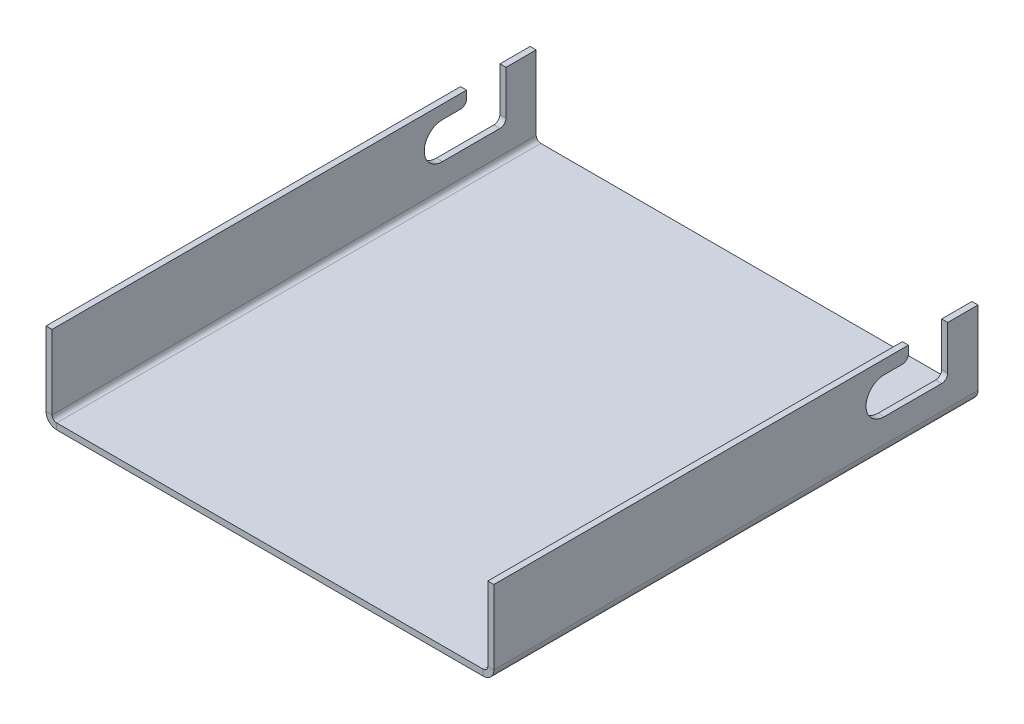
ISO-10303-21;
HEADER;
FILE_DESCRIPTION(('STEP AP214'),'2;1');
FILE_NAME('part.step','',(''),(''),'','','');
FILE_SCHEMA(('AUTOMOTIVE_DESIGN { 1 0 10303 214 1 1 1 1 }'));
ENDSEC;
DATA;
#1=APPLICATION_CONTEXT('core data for automotive mechanical design processes');
#2=APPLICATION_PROTOCOL_DEFINITION('international standard','automotive_design',2000,#1);
#3=PRODUCT_CONTEXT('',#1,'mechanical');
#4=PRODUCT('Part','Part','',(#3));
#5=PRODUCT_RELATED_PRODUCT_CATEGORY('part','',(#4));
#6=PRODUCT_DEFINITION_FORMATION('','',#4);
#7=PRODUCT_DEFINITION_CONTEXT('part definition',#1,'design');
#8=PRODUCT_DEFINITION('design','',#6,#7);
#9=PRODUCT_DEFINITION_SHAPE('','',#8);
#10=(LENGTH_UNIT() NAMED_UNIT(*) SI_UNIT(.MILLI.,.METRE.));
#11=(NAMED_UNIT(*) PLANE_ANGLE_UNIT() SI_UNIT($,.RADIAN.));
#12=(NAMED_UNIT(*) SI_UNIT($,.STERADIAN.) SOLID_ANGLE_UNIT());
#13=UNCERTAINTY_MEASURE_WITH_UNIT(LENGTH_MEASURE(1.E-05),#10,'distance_accuracy_value','');
#14=(GEOMETRIC_REPRESENTATION_CONTEXT(3) GLOBAL_UNCERTAINTY_ASSIGNED_CONTEXT((#13)) GLOBAL_UNIT_ASSIGNED_CONTEXT((#10,
#11,#12)) REPRESENTATION_CONTEXT('',''));
#15=CARTESIAN_POINT('',(0.,0.,0.));
#16=DIRECTION('',(0.,0.,1.));
#17=DIRECTION('',(1.,0.,0.));
#18=AXIS2_PLACEMENT_3D('',#15,#16,#17);
#19=CARTESIAN_POINT('',(0.,-1.,0.));
#20=DIRECTION('',(0.,1.,0.));
#21=DIRECTION('',(0.,0.,1.));
#22=AXIS2_PLACEMENT_3D('',#19,#20,#21);
#23=PLANE('',#22);
#24=DIRECTION('',(0.,0.,1.));
#25=VECTOR('',#24,1.);
#26=CARTESIAN_POINT('',(-35.238,-0.999999999999997,40.));
#27=LINE('',#26,#25);
#28=CARTESIAN_POINT('',(-35.238,-0.999999999999997,40.));
#29=VERTEX_POINT('',#28);
#30=CARTESIAN_POINT('',(-35.238,-1.,-40.));
#31=VERTEX_POINT('',#30);
#32=EDGE_CURVE('E501',#29,#31,#27,.F.);
#33=ORIENTED_EDGE('',*,*,#32,.T.);
#34=DIRECTION('',(-1.,0.,0.));
#35=VECTOR('',#34,1.);
#36=CARTESIAN_POINT('',(36.,-1.,-40.));
#37=LINE('',#36,#35);
#38=CARTESIAN_POINT('',(35.238,-0.999999999999997,-40.));
#39=VERTEX_POINT('',#38);
#40=EDGE_CURVE('E584',#39,#31,#37,.T.);
#41=ORIENTED_EDGE('',*,*,#40,.F.);
#42=DIRECTION('',(0.,0.,-1.));
#43=VECTOR('',#42,1.);
#44=CARTESIAN_POINT('',(35.238,-0.999999999999997,-40.));
#45=LINE('',#44,#43);
#46=CARTESIAN_POINT('',(35.238,-1.,40.));
#47=VERTEX_POINT('',#46);
#48=EDGE_CURVE('E558',#39,#47,#45,.F.);
#49=ORIENTED_EDGE('',*,*,#48,.T.);
#50=DIRECTION('',(1.,0.,0.));
#51=VECTOR('',#50,1.);
#52=CARTESIAN_POINT('',(36.,-1.,40.));
#53=LINE('',#52,#51);
#54=EDGE_CURVE('E582',#29,#47,#53,.T.);
#55=ORIENTED_EDGE('',*,*,#54,.F.);
#56=EDGE_LOOP('',(#33,#41,#49,#55));
#57=FACE_BOUND('',#56,.T.);
#58=DIRECTION('',(-1.,0.,0.));
#59=VECTOR('',#58,1.);
#60=CARTESIAN_POINT('',(25.238,-1.,-25.));
#61=LINE('',#60,#59);
#62=CARTESIAN_POINT('',(25.238,-1.,-25.));
#63=VERTEX_POINT('',#62);
#64=CARTESIAN_POINT('',(-25.238,-1.,-25.));
#65=VERTEX_POINT('',#64);
#66=EDGE_CURVE('E212',#63,#65,#61,.T.);
#67=ORIENTED_EDGE('',*,*,#66,.T.);
#68=DIRECTION('',(0.,0.,1.));
#69=VECTOR('',#68,1.);
#70=CARTESIAN_POINT('',(-25.238,-1.,25.));
#71=LINE('',#70,#69);
#72=CARTESIAN_POINT('',(-25.238,-1.,25.));
#73=VERTEX_POINT('',#72);
#74=EDGE_CURVE('E13',#65,#73,#71,.T.);
#75=ORIENTED_EDGE('',*,*,#74,.T.);
#76=DIRECTION('',(1.,0.,0.));
#77=VECTOR('',#76,1.);
#78=CARTESIAN_POINT('',(25.238,-1.,25.));
#79=LINE('',#78,#77);
#80=CARTESIAN_POINT('',(25.238,-1.,25.));
#81=VERTEX_POINT('',#80);
#82=EDGE_CURVE('E638',#73,#81,#79,.T.);
#83=ORIENTED_EDGE('',*,*,#82,.T.);
#84=DIRECTION('',(0.,0.,-1.));
#85=VECTOR('',#84,1.);
#86=CARTESIAN_POINT('',(25.238,-1.,25.));
#87=LINE('',#86,#85);
#88=EDGE_CURVE('E642',#81,#63,#87,.T.);
#89=ORIENTED_EDGE('',*,*,#88,.T.);
#90=EDGE_LOOP('',(#67,#75,#83,#89));
#91=FACE_BOUND('',#90,.T.);
#92=ADVANCED_FACE('F203',(#57,#91),#23,.F.);
#93=CARTESIAN_POINT('',(37.,13.,40.));
#94=DIRECTION('',(0.,-1.,0.));
#95=DIRECTION('',(1.,0.,0.));
#96=AXIS2_PLACEMENT_3D('',#93,#94,#95);
#97=PLANE('',#96);
#98=DIRECTION('',(0.,0.,1.));
#99=VECTOR('',#98,1.);
#100=CARTESIAN_POINT('',(37.,13.,40.));
#101=LINE('',#100,#99);
#102=CARTESIAN_POINT('',(37.,13.0000000000003,-28.5));
#103=VERTEX_POINT('',#102);
#104=CARTESIAN_POINT('',(37.,13.,40.));
#105=VERTEX_POINT('',#104);
#106=EDGE_CURVE('E536',#103,#105,#101,.T.);
#107=ORIENTED_EDGE('',*,*,#106,.F.);
#108=DIRECTION('',(-1.,0.,0.));
#109=VECTOR('',#108,1.);
#110=CARTESIAN_POINT('',(37.,13.0000000000003,-28.5));
#111=LINE('',#110,#109);
#112=CARTESIAN_POINT('',(36.,13.0000000000003,-28.5));
#113=VERTEX_POINT('',#112);
#114=EDGE_CURVE('E445',#103,#113,#111,.T.);
#115=ORIENTED_EDGE('',*,*,#114,.T.);
#116=DIRECTION('',(0.,0.,1.));
#117=VECTOR('',#116,1.);
#118=CARTESIAN_POINT('',(36.,13.,40.));
#119=LINE('',#118,#117);
#120=CARTESIAN_POINT('',(36.,13.,40.));
#121=VERTEX_POINT('',#120);
#122=EDGE_CURVE('E546',#113,#121,#119,.T.);
#123=ORIENTED_EDGE('',*,*,#122,.T.);
#124=DIRECTION('',(-1.,0.,0.));
#125=VECTOR('',#124,1.);
#126=CARTESIAN_POINT('',(37.,13.,40.));
#127=LINE('',#126,#125);
#128=EDGE_CURVE('E544',#105,#121,#127,.T.);
#129=ORIENTED_EDGE('',*,*,#128,.F.);
#130=EDGE_LOOP('',(#107,#115,#123,#129));
#131=FACE_BOUND('',#130,.T.);
#132=ADVANCED_FACE('F660',(#131),#97,.F.);
#133=CARTESIAN_POINT('',(-37.,13.,-40.));
#134=DIRECTION('',(0.,-1.,0.));
#135=DIRECTION('',(1.,0.,0.));
#136=AXIS2_PLACEMENT_3D('',#133,#134,#135);
#137=PLANE('',#136);
#138=DIRECTION('',(0.,0.,-1.));
#139=VECTOR('',#138,1.);
#140=CARTESIAN_POINT('',(-36.,13.,-40.));
#141=LINE('',#140,#139);
#142=CARTESIAN_POINT('',(-36.,13.,40.));
#143=VERTEX_POINT('',#142);
#144=CARTESIAN_POINT('',(-36.,13.,-28.5));
#145=VERTEX_POINT('',#144);
#146=EDGE_CURVE('E481',#143,#145,#141,.T.);
#147=ORIENTED_EDGE('',*,*,#146,.T.);
#148=DIRECTION('',(-1.,0.,0.));
#149=VECTOR('',#148,1.);
#150=CARTESIAN_POINT('',(-37.,13.,-28.5));
#151=LINE('',#150,#149);
#152=CARTESIAN_POINT('',(-37.,13.,-28.5));
#153=VERTEX_POINT('',#152);
#154=EDGE_CURVE('E594',#145,#153,#151,.T.);
#155=ORIENTED_EDGE('',*,*,#154,.T.);
#156=DIRECTION('',(0.,0.,-1.));
#157=VECTOR('',#156,1.);
#158=CARTESIAN_POINT('',(-37.,13.,-40.));
#159=LINE('',#158,#157);
#160=CARTESIAN_POINT('',(-37.,13.,40.));
#161=VERTEX_POINT('',#160);
#162=EDGE_CURVE('E484',#161,#153,#159,.T.);
#163=ORIENTED_EDGE('',*,*,#162,.F.);
#164=DIRECTION('',(1.,0.,0.));
#165=VECTOR('',#164,1.);
#166=CARTESIAN_POINT('',(-37.,13.,40.));
#167=LINE('',#166,#165);
#168=EDGE_CURVE('E497',#161,#143,#167,.T.);
#169=ORIENTED_EDGE('',*,*,#168,.T.);
#170=EDGE_LOOP('',(#147,#155,#163,#169));
#171=FACE_BOUND('',#170,.T.);
#172=ADVANCED_FACE('F651',(#171),#137,.F.);
#173=ORIENTED_EDGE('',*,*,#74,.F.);
#174=ORIENTED_EDGE('',*,*,#66,.F.);
#175=ORIENTED_EDGE('',*,*,#88,.F.);
#176=ORIENTED_EDGE('',*,*,#82,.F.);
#177=EDGE_LOOP('',(#173,#174,#175,#176));
#178=FACE_BOUND('',#177,.T.);
#179=ADVANCED_FACE('F648',(#178),#23,.F.);
#180=CARTESIAN_POINT('',(0.,0.,0.));
#181=DIRECTION('',(0.,1.,0.));
#182=DIRECTION('',(0.,0.,1.));
#183=AXIS2_PLACEMENT_3D('',#180,#181,#182);
#184=PLANE('',#183);
#185=DIRECTION('',(-1.,0.,0.));
#186=VECTOR('',#185,1.);
#187=CARTESIAN_POINT('',(36.,0.,-40.));
#188=LINE('',#187,#186);
#189=CARTESIAN_POINT('',(35.238,0.,-40.));
#190=VERTEX_POINT('',#189);
#191=CARTESIAN_POINT('',(-35.238,0.,-40.));
#192=VERTEX_POINT('',#191);
#193=EDGE_CURVE('E585',#190,#192,#188,.T.);
#194=ORIENTED_EDGE('',*,*,#193,.T.);
#195=DIRECTION('',(0.,0.,1.));
#196=VECTOR('',#195,1.);
#197=CARTESIAN_POINT('',(-35.238,0.,40.));
#198=LINE('',#197,#196);
#199=CARTESIAN_POINT('',(-35.238,0.,40.));
#200=VERTEX_POINT('',#199);
#201=EDGE_CURVE('E513',#200,#192,#198,.F.);
#202=ORIENTED_EDGE('',*,*,#201,.F.);
#203=DIRECTION('',(1.,0.,0.));
#204=VECTOR('',#203,1.);
#205=CARTESIAN_POINT('',(36.,0.,40.));
#206=LINE('',#205,#204);
#207=CARTESIAN_POINT('',(35.238,0.,40.));
#208=VERTEX_POINT('',#207);
#209=EDGE_CURVE('E579',#200,#208,#206,.T.);
#210=ORIENTED_EDGE('',*,*,#209,.T.);
#211=DIRECTION('',(0.,0.,-1.));
#212=VECTOR('',#211,1.);
#213=CARTESIAN_POINT('',(35.238,0.,-40.));
#214=LINE('',#213,#212);
#215=EDGE_CURVE('E571',#190,#208,#214,.F.);
#216=ORIENTED_EDGE('',*,*,#215,.F.);
#217=EDGE_LOOP('',(#194,#202,#210,#216));
#218=FACE_BOUND('',#217,.T.);
#219=ADVANCED_FACE('F650',(#218),#184,.T.);
#220=CARTESIAN_POINT('',(36.,-1.,40.));
#221=DIRECTION('',(0.,0.,1.));
#222=DIRECTION('',(1.,0.,0.));
#223=AXIS2_PLACEMENT_3D('',#220,#221,#222);
#224=PLANE('',#223);
#225=ORIENTED_EDGE('',*,*,#209,.F.);
#226=DIRECTION('',(0.,-1.,0.));
#227=VECTOR('',#226,1.);
#228=CARTESIAN_POINT('',(-35.238,0.,40.));
#229=LINE('',#228,#227);
#230=EDGE_CURVE('E507',#200,#29,#229,.T.);
#231=ORIENTED_EDGE('',*,*,#230,.T.);
#232=ORIENTED_EDGE('',*,*,#54,.T.);
#233=DIRECTION('',(0.,-1.,0.));
#234=VECTOR('',#233,1.);
#235=CARTESIAN_POINT('',(35.238,0.,40.));
#236=LINE('',#235,#234);
#237=EDGE_CURVE('E576',#208,#47,#236,.T.);
#238=ORIENTED_EDGE('',*,*,#237,.F.);
#239=EDGE_LOOP('',(#225,#231,#232,#238));
#240=FACE_BOUND('',#239,.T.);
#241=ADVANCED_FACE('F657',(#240),#224,.T.);
#242=CARTESIAN_POINT('',(36.,-1.,-40.));
#243=DIRECTION('',(0.,0.,-1.));
#244=DIRECTION('',(-1.,0.,0.));
#245=AXIS2_PLACEMENT_3D('',#242,#243,#244);
#246=PLANE('',#245);
#247=DIRECTION('',(0.,-1.,0.));
#248=VECTOR('',#247,1.);
#249=CARTESIAN_POINT('',(-35.238,0.,-40.));
#250=LINE('',#249,#248);
#251=EDGE_CURVE('E518',#192,#31,#250,.T.);
#252=ORIENTED_EDGE('',*,*,#251,.F.);
#253=ORIENTED_EDGE('',*,*,#193,.F.);
#254=DIRECTION('',(0.,-1.,0.));
#255=VECTOR('',#254,1.);
#256=CARTESIAN_POINT('',(35.238,0.,-40.));
#257=LINE('',#256,#255);
#258=EDGE_CURVE('E565',#190,#39,#257,.T.);
#259=ORIENTED_EDGE('',*,*,#258,.T.);
#260=ORIENTED_EDGE('',*,*,#40,.T.);
#261=EDGE_LOOP('',(#252,#253,#259,#260));
#262=FACE_BOUND('',#261,.T.);
#263=ADVANCED_FACE('F677',(#262),#246,.T.);
#264=CARTESIAN_POINT('',(35.238,0.762000000000002,40.));
#265=DIRECTION('',(0.,0.,1.));
#266=DIRECTION('',(1.,0.,0.));
#267=AXIS2_PLACEMENT_3D('',#264,#265,#266);
#268=PLANE('',#267);
#269=DIRECTION('',(1.,0.,0.));
#270=VECTOR('',#269,1.);
#271=CARTESIAN_POINT('',(36.,0.761999999999999,40.));
#272=LINE('',#271,#270);
#273=CARTESIAN_POINT('',(36.,0.761999999999999,40.));
#274=VERTEX_POINT('',#273);
#275=CARTESIAN_POINT('',(37.,0.761999999999995,40.));
#276=VERTEX_POINT('',#275);
#277=EDGE_CURVE('E521',#274,#276,#272,.T.);
#278=ORIENTED_EDGE('',*,*,#277,.F.);
#279=CARTESIAN_POINT('',(35.238,0.762000000000002,40.));
#280=DIRECTION('',(0.,0.,-1.));
#281=DIRECTION('',(-1.,0.,0.));
#282=AXIS2_PLACEMENT_3D('',#279,#280,#281);
#283=CIRCLE('',#282,0.761999999999999);
#284=EDGE_CURVE('E568',#208,#274,#283,.F.);
#285=ORIENTED_EDGE('',*,*,#284,.F.);
#286=ORIENTED_EDGE('',*,*,#237,.T.);
#287=CARTESIAN_POINT('',(35.238,0.762000000000002,40.));
#288=DIRECTION('',(0.,0.,-1.));
#289=DIRECTION('',(-1.,0.,0.));
#290=AXIS2_PLACEMENT_3D('',#287,#288,#289);
#291=CIRCLE('',#290,1.762);
#292=EDGE_CURVE('E561',#47,#276,#291,.F.);
#293=ORIENTED_EDGE('',*,*,#292,.T.);
#294=EDGE_LOOP('',(#278,#285,#286,#293));
#295=FACE_BOUND('',#294,.T.);
#296=ADVANCED_FACE('F783',(#295),#268,.T.);
#297=CARTESIAN_POINT('',(35.238,0.762000000000002,-40.));
#298=DIRECTION('',(0.,0.,1.));
#299=DIRECTION('',(1.,0.,0.));
#300=AXIS2_PLACEMENT_3D('',#297,#298,#299);
#301=PLANE('',#300);
#302=CARTESIAN_POINT('',(35.238,0.762000000000002,-40.));
#303=DIRECTION('',(0.,0.,-1.));
#304=DIRECTION('',(-1.,0.,0.));
#305=AXIS2_PLACEMENT_3D('',#302,#303,#304);
#306=CIRCLE('',#305,0.761999999999999);
#307=CARTESIAN_POINT('',(36.,0.761999999999999,-40.));
#308=VERTEX_POINT('',#307);
#309=EDGE_CURVE('E557',#308,#190,#306,.T.);
#310=ORIENTED_EDGE('',*,*,#309,.F.);
#311=DIRECTION('',(1.,0.,0.));
#312=VECTOR('',#311,1.);
#313=CARTESIAN_POINT('',(36.,0.761999999999999,-40.));
#314=LINE('',#313,#312);
#315=CARTESIAN_POINT('',(37.,0.761999999999995,-40.));
#316=VERTEX_POINT('',#315);
#317=EDGE_CURVE('E526',#308,#316,#314,.T.);
#318=ORIENTED_EDGE('',*,*,#317,.T.);
#319=CARTESIAN_POINT('',(35.238,0.762000000000002,-40.));
#320=DIRECTION('',(0.,0.,-1.));
#321=DIRECTION('',(-1.,0.,0.));
#322=AXIS2_PLACEMENT_3D('',#319,#320,#321);
#323=CIRCLE('',#322,1.762);
#324=EDGE_CURVE('E562',#316,#39,#323,.T.);
#325=ORIENTED_EDGE('',*,*,#324,.T.);
#326=ORIENTED_EDGE('',*,*,#258,.F.);
#327=EDGE_LOOP('',(#310,#318,#325,#326));
#328=FACE_BOUND('',#327,.T.);
#329=ADVANCED_FACE('F778',(#328),#301,.F.);
#330=CARTESIAN_POINT('',(35.238,0.762000000000002,-40.));
#331=DIRECTION('',(0.,0.,-1.));
#332=DIRECTION('',(1.,0.,0.));
#333=AXIS2_PLACEMENT_3D('',#330,#331,#332);
#334=CYLINDRICAL_SURFACE('',#333,1.762);
#335=ORIENTED_EDGE('',*,*,#48,.F.);
#336=ORIENTED_EDGE('',*,*,#324,.F.);
#337=DIRECTION('',(0.,0.,1.));
#338=VECTOR('',#337,1.);
#339=CARTESIAN_POINT('',(37.,0.761999999999995,0.));
#340=LINE('',#339,#338);
#341=EDGE_CURVE('E529',#316,#276,#340,.T.);
#342=ORIENTED_EDGE('',*,*,#341,.T.);
#343=ORIENTED_EDGE('',*,*,#292,.F.);
#344=EDGE_LOOP('',(#335,#336,#342,#343));
#345=FACE_BOUND('',#344,.T.);
#346=ADVANCED_FACE('F775',(#345),#334,.T.);
#347=CARTESIAN_POINT('',(35.238,0.762000000000002,-40.));
#348=DIRECTION('',(0.,0.,-1.));
#349=DIRECTION('',(1.,0.,0.));
#350=AXIS2_PLACEMENT_3D('',#347,#348,#349);
#351=CYLINDRICAL_SURFACE('',#350,0.761999999999999);
#352=ORIENTED_EDGE('',*,*,#215,.T.);
#353=ORIENTED_EDGE('',*,*,#284,.T.);
#354=DIRECTION('',(0.,0.,-1.));
#355=VECTOR('',#354,1.);
#356=CARTESIAN_POINT('',(36.,0.761999999999999,40.));
#357=LINE('',#356,#355);
#358=EDGE_CURVE('E524',#274,#308,#357,.T.);
#359=ORIENTED_EDGE('',*,*,#358,.T.);
#360=ORIENTED_EDGE('',*,*,#309,.T.);
#361=EDGE_LOOP('',(#352,#353,#359,#360));
#362=FACE_BOUND('',#361,.T.);
#363=ADVANCED_FACE('F773',(#362),#351,.F.);
#364=CARTESIAN_POINT('',(37.,13.,-40.));
#365=DIRECTION('',(0.,0.,1.));
#366=DIRECTION('',(1.,0.,0.));
#367=AXIS2_PLACEMENT_3D('',#364,#365,#366);
#368=PLANE('',#367);
#369=ORIENTED_EDGE('',*,*,#317,.F.);
#370=DIRECTION('',(0.,1.,0.));
#371=VECTOR('',#370,1.);
#372=CARTESIAN_POINT('',(36.,13.,-40.));
#373=LINE('',#372,#371);
#374=CARTESIAN_POINT('',(36.,13.,-40.));
#375=VERTEX_POINT('',#374);
#376=EDGE_CURVE('E533',#308,#375,#373,.T.);
#377=ORIENTED_EDGE('',*,*,#376,.T.);
#378=DIRECTION('',(-1.,0.,0.));
#379=VECTOR('',#378,1.);
#380=CARTESIAN_POINT('',(37.,13.,-40.));
#381=LINE('',#380,#379);
#382=CARTESIAN_POINT('',(37.,13.,-40.));
#383=VERTEX_POINT('',#382);
#384=EDGE_CURVE('E554',#383,#375,#381,.T.);
#385=ORIENTED_EDGE('',*,*,#384,.F.);
#386=DIRECTION('',(0.,1.,0.));
#387=VECTOR('',#386,1.);
#388=CARTESIAN_POINT('',(37.,13.,-40.));
#389=LINE('',#388,#387);
#390=EDGE_CURVE('E534',#316,#383,#389,.T.);
#391=ORIENTED_EDGE('',*,*,#390,.F.);
#392=EDGE_LOOP('',(#369,#377,#385,#391));
#393=FACE_BOUND('',#392,.T.);
#394=ADVANCED_FACE('F766',(#393),#368,.F.);
#395=CARTESIAN_POINT('',(37.,0.,40.));
#396=DIRECTION('',(0.,0.,-1.));
#397=DIRECTION('',(-1.,0.,0.));
#398=AXIS2_PLACEMENT_3D('',#395,#396,#397);
#399=PLANE('',#398);
#400=ORIENTED_EDGE('',*,*,#277,.T.);
#401=DIRECTION('',(0.,-1.,0.));
#402=VECTOR('',#401,1.);
#403=CARTESIAN_POINT('',(37.,0.,40.));
#404=LINE('',#403,#402);
#405=EDGE_CURVE('E541',#105,#276,#404,.T.);
#406=ORIENTED_EDGE('',*,*,#405,.F.);
#407=ORIENTED_EDGE('',*,*,#128,.T.);
#408=DIRECTION('',(0.,-1.,0.));
#409=VECTOR('',#408,1.);
#410=CARTESIAN_POINT('',(36.,0.,40.));
#411=LINE('',#410,#409);
#412=EDGE_CURVE('E537',#121,#274,#411,.T.);
#413=ORIENTED_EDGE('',*,*,#412,.T.);
#414=EDGE_LOOP('',(#400,#406,#407,#413));
#415=FACE_BOUND('',#414,.T.);
#416=ADVANCED_FACE('F761',(#415),#399,.F.);
#417=CARTESIAN_POINT('',(37.,-1.37999270860737E-13,0.));
#418=DIRECTION('',(-1.,0.,0.));
#419=DIRECTION('',(0.,-1.,0.));
#420=AXIS2_PLACEMENT_3D('',#417,#418,#419);
#421=PLANE('',#420);
#422=DIRECTION('',(0.,0.,-1.));
#423=VECTOR('',#422,1.);
#424=CARTESIAN_POINT('',(37.0000000000001,10.7620000000002,-24.5));
#425=LINE('',#424,#423);
#426=CARTESIAN_POINT('',(37.0000000000001,10.7620000000002,-24.5));
#427=VERTEX_POINT('',#426);
#428=CARTESIAN_POINT('',(37.0000000000001,10.7620000000002,-27.5));
#429=VERTEX_POINT('',#428);
#430=EDGE_CURVE('E424',#427,#429,#425,.T.);
#431=ORIENTED_EDGE('',*,*,#430,.T.);
#432=CARTESIAN_POINT('',(37.,11.7620000000002,-27.5));
#433=DIRECTION('',(-1.,0.,0.));
#434=DIRECTION('',(0.,-1.,0.));
#435=AXIS2_PLACEMENT_3D('',#432,#433,#434);
#436=CIRCLE('',#435,1.);
#437=CARTESIAN_POINT('',(37.0000000000001,11.7620000000002,-28.5));
#438=VERTEX_POINT('',#437);
#439=EDGE_CURVE('E611',#429,#438,#436,.F.);
#440=ORIENTED_EDGE('',*,*,#439,.T.);
#441=DIRECTION('',(0.,1.,0.));
#442=VECTOR('',#441,1.);
#443=CARTESIAN_POINT('',(37.0000000000001,10.7620000000002,-28.5));
#444=LINE('',#443,#442);
#445=EDGE_CURVE('E426',#438,#103,#444,.T.);
#446=ORIENTED_EDGE('',*,*,#445,.T.);
#447=ORIENTED_EDGE('',*,*,#106,.T.);
#448=ORIENTED_EDGE('',*,*,#405,.T.);
#449=ORIENTED_EDGE('',*,*,#341,.F.);
#450=ORIENTED_EDGE('',*,*,#390,.T.);
#451=CARTESIAN_POINT('',(37.,13.,-35.));
#452=VERTEX_POINT('',#451);
#453=EDGE_CURVE('E538',#383,#452,#101,.T.);
#454=ORIENTED_EDGE('',*,*,#453,.T.);
#455=DIRECTION('',(0.,-1.,0.));
#456=VECTOR('',#455,1.);
#457=CARTESIAN_POINT('',(37.,13.0000000000003,-35.));
#458=LINE('',#457,#456);
#459=CARTESIAN_POINT('',(37.0000000000001,5.76200000000024,-35.));
#460=VERTEX_POINT('',#459);
#461=EDGE_CURVE('E408',#452,#460,#458,.T.);
#462=ORIENTED_EDGE('',*,*,#461,.T.);
#463=CARTESIAN_POINT('',(37.,5.76200000000024,-34.));
#464=DIRECTION('',(-1.,0.,0.));
#465=DIRECTION('',(0.,-1.,0.));
#466=AXIS2_PLACEMENT_3D('',#463,#464,#465);
#467=CIRCLE('',#466,1.);
#468=CARTESIAN_POINT('',(37.0000000000001,4.76200000000024,-34.));
#469=VERTEX_POINT('',#468);
#470=EDGE_CURVE('E404',#460,#469,#467,.T.);
#471=ORIENTED_EDGE('',*,*,#470,.T.);
#472=DIRECTION('',(0.,0.,1.));
#473=VECTOR('',#472,1.);
#474=CARTESIAN_POINT('',(37.0000000000001,4.76200000000024,-35.));
#475=LINE('',#474,#473);
#476=CARTESIAN_POINT('',(37.0000000000001,4.76200000000024,-24.5));
#477=VERTEX_POINT('',#476);
#478=EDGE_CURVE('E396',#469,#477,#475,.T.);
#479=ORIENTED_EDGE('',*,*,#478,.T.);
#480=CARTESIAN_POINT('',(37.0000000000001,7.76200000000024,-24.5));
#481=DIRECTION('',(-1.,0.,0.));
#482=DIRECTION('',(0.,-1.,0.));
#483=AXIS2_PLACEMENT_3D('',#480,#481,#482);
#484=CIRCLE('',#483,3.);
#485=EDGE_CURVE('E401',#477,#427,#484,.T.);
#486=ORIENTED_EDGE('',*,*,#485,.T.);
#487=EDGE_LOOP('',(#431,#440,#446,#447,#448,#449,#450,#454,#462,#471,#479,#486));
#488=FACE_BOUND('',#487,.T.);
#489=ADVANCED_FACE('F399',(#488),#421,.F.);
#490=CARTESIAN_POINT('',(36.,-1.34507789521894E-13,0.));
#491=DIRECTION('',(-1.,0.,0.));
#492=DIRECTION('',(0.,-1.,0.));
#493=AXIS2_PLACEMENT_3D('',#490,#491,#492);
#494=PLANE('',#493);
#495=DIRECTION('',(0.,1.,0.));
#496=VECTOR('',#495,1.);
#497=CARTESIAN_POINT('',(36.,-1.34507789521894E-13,-28.5));
#498=LINE('',#497,#496);
#499=CARTESIAN_POINT('',(36.,11.7620000000002,-28.5));
#500=VERTEX_POINT('',#499);
#501=EDGE_CURVE('E458',#500,#113,#498,.T.);
#502=ORIENTED_EDGE('',*,*,#501,.F.);
#503=CARTESIAN_POINT('',(36.,11.7620000000002,-27.5));
#504=DIRECTION('',(-1.,0.,0.));
#505=DIRECTION('',(0.,-1.,0.));
#506=AXIS2_PLACEMENT_3D('',#503,#504,#505);
#507=CIRCLE('',#506,1.);
#508=CARTESIAN_POINT('',(36.,10.7620000000002,-27.5));
#509=VERTEX_POINT('',#508);
#510=EDGE_CURVE('E607',#500,#509,#507,.T.);
#511=ORIENTED_EDGE('',*,*,#510,.T.);
#512=DIRECTION('',(0.,0.,-1.));
#513=VECTOR('',#512,1.);
#514=CARTESIAN_POINT('',(36.,10.7620000000002,0.));
#515=LINE('',#514,#513);
#516=CARTESIAN_POINT('',(36.,10.7620000000002,-24.5));
#517=VERTEX_POINT('',#516);
#518=EDGE_CURVE('E463',#517,#509,#515,.T.);
#519=ORIENTED_EDGE('',*,*,#518,.F.);
#520=CARTESIAN_POINT('',(36.,7.76200000000024,-24.5));
#521=DIRECTION('',(-1.,0.,0.));
#522=DIRECTION('',(0.,-1.,0.));
#523=AXIS2_PLACEMENT_3D('',#520,#521,#522);
#524=CIRCLE('',#523,3.);
#525=CARTESIAN_POINT('',(36.,4.76200000000024,-24.5));
#526=VERTEX_POINT('',#525);
#527=EDGE_CURVE('E461',#526,#517,#524,.T.);
#528=ORIENTED_EDGE('',*,*,#527,.F.);
#529=DIRECTION('',(0.,0.,1.));
#530=VECTOR('',#529,1.);
#531=CARTESIAN_POINT('',(36.,4.76200000000024,0.));
#532=LINE('',#531,#530);
#533=CARTESIAN_POINT('',(36.,4.76200000000024,-34.));
#534=VERTEX_POINT('',#533);
#535=EDGE_CURVE('E414',#534,#526,#532,.T.);
#536=ORIENTED_EDGE('',*,*,#535,.F.);
#537=CARTESIAN_POINT('',(36.,5.76200000000024,-34.));
#538=DIRECTION('',(-1.,0.,0.));
#539=DIRECTION('',(0.,-1.,0.));
#540=AXIS2_PLACEMENT_3D('',#537,#538,#539);
#541=CIRCLE('',#540,1.);
#542=CARTESIAN_POINT('',(36.,5.76200000000024,-35.));
#543=VERTEX_POINT('',#542);
#544=EDGE_CURVE('E631',#534,#543,#541,.F.);
#545=ORIENTED_EDGE('',*,*,#544,.T.);
#546=DIRECTION('',(0.,-1.,0.));
#547=VECTOR('',#546,1.);
#548=CARTESIAN_POINT('',(36.,-1.34507789521894E-13,-35.));
#549=LINE('',#548,#547);
#550=CARTESIAN_POINT('',(36.,13.0000000000003,-35.));
#551=VERTEX_POINT('',#550);
#552=EDGE_CURVE('E452',#551,#543,#549,.T.);
#553=ORIENTED_EDGE('',*,*,#552,.F.);
#554=EDGE_CURVE('E547',#375,#551,#119,.T.);
#555=ORIENTED_EDGE('',*,*,#554,.F.);
#556=ORIENTED_EDGE('',*,*,#376,.F.);
#557=ORIENTED_EDGE('',*,*,#358,.F.);
#558=ORIENTED_EDGE('',*,*,#412,.F.);
#559=ORIENTED_EDGE('',*,*,#122,.F.);
#560=EDGE_LOOP('',(#502,#511,#519,#528,#536,#545,#553,#555,#556,#557,#558,#559));
#561=FACE_BOUND('',#560,.T.);
#562=ADVANCED_FACE('F760',(#561),#494,.T.);
#563=ORIENTED_EDGE('',*,*,#554,.T.);
#564=DIRECTION('',(-1.,0.,0.));
#565=VECTOR('',#564,1.);
#566=CARTESIAN_POINT('',(37.,13.0000000000003,-35.));
#567=LINE('',#566,#565);
#568=EDGE_CURVE('E431',#452,#551,#567,.T.);
#569=ORIENTED_EDGE('',*,*,#568,.F.);
#570=ORIENTED_EDGE('',*,*,#453,.F.);
#571=ORIENTED_EDGE('',*,*,#384,.T.);
#572=EDGE_LOOP('',(#563,#569,#570,#571));
#573=FACE_BOUND('',#572,.T.);
#574=ADVANCED_FACE('F672',(#573),#97,.F.);
#575=CARTESIAN_POINT('',(-35.238,0.762000000000002,-40.));
#576=DIRECTION('',(0.,0.,-1.));
#577=DIRECTION('',(-1.,0.,0.));
#578=AXIS2_PLACEMENT_3D('',#575,#576,#577);
#579=PLANE('',#578);
#580=DIRECTION('',(-1.,0.,0.));
#581=VECTOR('',#580,1.);
#582=CARTESIAN_POINT('',(-36.,0.761999999999999,-40.));
#583=LINE('',#582,#581);
#584=CARTESIAN_POINT('',(-36.,0.761999999999999,-40.));
#585=VERTEX_POINT('',#584);
#586=CARTESIAN_POINT('',(-37.,0.761999999999995,-40.));
#587=VERTEX_POINT('',#586);
#588=EDGE_CURVE('E466',#585,#587,#583,.T.);
#589=ORIENTED_EDGE('',*,*,#588,.F.);
#590=CARTESIAN_POINT('',(-35.238,0.762000000000002,-40.));
#591=DIRECTION('',(0.,0.,1.));
#592=DIRECTION('',(1.,0.,0.));
#593=AXIS2_PLACEMENT_3D('',#590,#591,#592);
#594=CIRCLE('',#593,0.761999999999999);
#595=EDGE_CURVE('E510',#192,#585,#594,.F.);
#596=ORIENTED_EDGE('',*,*,#595,.F.);
#597=ORIENTED_EDGE('',*,*,#251,.T.);
#598=CARTESIAN_POINT('',(-35.238,0.762000000000002,-40.));
#599=DIRECTION('',(0.,0.,1.));
#600=DIRECTION('',(1.,0.,0.));
#601=AXIS2_PLACEMENT_3D('',#598,#599,#600);
#602=CIRCLE('',#601,1.762);
#603=EDGE_CURVE('E503',#31,#587,#602,.F.);
#604=ORIENTED_EDGE('',*,*,#603,.T.);
#605=EDGE_LOOP('',(#589,#596,#597,#604));
#606=FACE_BOUND('',#605,.T.);
#607=ADVANCED_FACE('F683',(#606),#579,.T.);
#608=CARTESIAN_POINT('',(-35.238,0.762000000000002,40.));
#609=DIRECTION('',(0.,0.,-1.));
#610=DIRECTION('',(-1.,0.,0.));
#611=AXIS2_PLACEMENT_3D('',#608,#609,#610);
#612=PLANE('',#611);
#613=CARTESIAN_POINT('',(-35.238,0.762000000000002,40.));
#614=DIRECTION('',(0.,0.,1.));
#615=DIRECTION('',(1.,0.,0.));
#616=AXIS2_PLACEMENT_3D('',#613,#614,#615);
#617=CIRCLE('',#616,0.761999999999999);
#618=CARTESIAN_POINT('',(-36.,0.761999999999999,40.));
#619=VERTEX_POINT('',#618);
#620=EDGE_CURVE('E500',#619,#200,#617,.T.);
#621=ORIENTED_EDGE('',*,*,#620,.F.);
#622=DIRECTION('',(-1.,0.,0.));
#623=VECTOR('',#622,1.);
#624=CARTESIAN_POINT('',(-36.,0.761999999999999,40.));
#625=LINE('',#624,#623);
#626=CARTESIAN_POINT('',(-37.,0.761999999999995,40.));
#627=VERTEX_POINT('',#626);
#628=EDGE_CURVE('E469',#619,#627,#625,.T.);
#629=ORIENTED_EDGE('',*,*,#628,.T.);
#630=CARTESIAN_POINT('',(-35.238,0.762000000000002,40.));
#631=DIRECTION('',(0.,0.,1.));
#632=DIRECTION('',(1.,0.,0.));
#633=AXIS2_PLACEMENT_3D('',#630,#631,#632);
#634=CIRCLE('',#633,1.762);
#635=EDGE_CURVE('E504',#627,#29,#634,.T.);
#636=ORIENTED_EDGE('',*,*,#635,.T.);
#637=ORIENTED_EDGE('',*,*,#230,.F.);
#638=EDGE_LOOP('',(#621,#629,#636,#637));
#639=FACE_BOUND('',#638,.T.);
#640=ADVANCED_FACE('F747',(#639),#612,.F.);
#641=CARTESIAN_POINT('',(-35.238,0.762000000000002,40.));
#642=DIRECTION('',(0.,0.,1.));
#643=DIRECTION('',(-1.,0.,0.));
#644=AXIS2_PLACEMENT_3D('',#641,#642,#643);
#645=CYLINDRICAL_SURFACE('',#644,1.762);
#646=ORIENTED_EDGE('',*,*,#32,.F.);
#647=ORIENTED_EDGE('',*,*,#635,.F.);
#648=DIRECTION('',(0.,0.,-1.));
#649=VECTOR('',#648,1.);
#650=CARTESIAN_POINT('',(-37.,0.761999999999995,0.));
#651=LINE('',#650,#649);
#652=EDGE_CURVE('E472',#627,#587,#651,.T.);
#653=ORIENTED_EDGE('',*,*,#652,.T.);
#654=ORIENTED_EDGE('',*,*,#603,.F.);
#655=EDGE_LOOP('',(#646,#647,#653,#654));
#656=FACE_BOUND('',#655,.T.);
#657=ADVANCED_FACE('F684',(#656),#645,.T.);
#658=CARTESIAN_POINT('',(-35.238,0.762000000000002,40.));
#659=DIRECTION('',(0.,0.,1.));
#660=DIRECTION('',(-1.,0.,0.));
#661=AXIS2_PLACEMENT_3D('',#658,#659,#660);
#662=CYLINDRICAL_SURFACE('',#661,0.761999999999999);
#663=ORIENTED_EDGE('',*,*,#201,.T.);
#664=ORIENTED_EDGE('',*,*,#595,.T.);
#665=DIRECTION('',(0.,0.,1.));
#666=VECTOR('',#665,1.);
#667=CARTESIAN_POINT('',(-36.,0.761999999999999,-40.));
#668=LINE('',#667,#666);
#669=EDGE_CURVE('E467',#585,#619,#668,.T.);
#670=ORIENTED_EDGE('',*,*,#669,.T.);
#671=ORIENTED_EDGE('',*,*,#620,.T.);
#672=EDGE_LOOP('',(#663,#664,#670,#671));
#673=FACE_BOUND('',#672,.T.);
#674=ADVANCED_FACE('F740',(#673),#662,.F.);
#675=CARTESIAN_POINT('',(-37.,0.,-40.));
#676=DIRECTION('',(0.,0.,1.));
#677=DIRECTION('',(1.,0.,0.));
#678=AXIS2_PLACEMENT_3D('',#675,#676,#677);
#679=PLANE('',#678);
#680=ORIENTED_EDGE('',*,*,#588,.T.);
#681=DIRECTION('',(0.,-1.,0.));
#682=VECTOR('',#681,1.);
#683=CARTESIAN_POINT('',(-37.,0.,-40.));
#684=LINE('',#683,#682);
#685=CARTESIAN_POINT('',(-37.,13.,-40.));
#686=VERTEX_POINT('',#685);
#687=EDGE_CURVE('E477',#686,#587,#684,.T.);
#688=ORIENTED_EDGE('',*,*,#687,.F.);
#689=DIRECTION('',(1.,0.,0.));
#690=VECTOR('',#689,1.);
#691=CARTESIAN_POINT('',(-37.,13.,-40.));
#692=LINE('',#691,#690);
#693=CARTESIAN_POINT('',(-36.,13.,-40.));
#694=VERTEX_POINT('',#693);
#695=EDGE_CURVE('E487',#686,#694,#692,.T.);
#696=ORIENTED_EDGE('',*,*,#695,.T.);
#697=DIRECTION('',(0.,-1.,0.));
#698=VECTOR('',#697,1.);
#699=CARTESIAN_POINT('',(-36.,0.,-40.));
#700=LINE('',#699,#698);
#701=EDGE_CURVE('E476',#694,#585,#700,.T.);
#702=ORIENTED_EDGE('',*,*,#701,.T.);
#703=EDGE_LOOP('',(#680,#688,#696,#702));
#704=FACE_BOUND('',#703,.T.);
#705=ADVANCED_FACE('F737',(#704),#679,.F.);
#706=CARTESIAN_POINT('',(-37.,13.,40.));
#707=DIRECTION('',(0.,0.,-1.));
#708=DIRECTION('',(-1.,0.,0.));
#709=AXIS2_PLACEMENT_3D('',#706,#707,#708);
#710=PLANE('',#709);
#711=ORIENTED_EDGE('',*,*,#628,.F.);
#712=DIRECTION('',(0.,1.,0.));
#713=VECTOR('',#712,1.);
#714=CARTESIAN_POINT('',(-36.,13.,40.));
#715=LINE('',#714,#713);
#716=EDGE_CURVE('E490',#619,#143,#715,.T.);
#717=ORIENTED_EDGE('',*,*,#716,.T.);
#718=ORIENTED_EDGE('',*,*,#168,.F.);
#719=DIRECTION('',(0.,1.,0.));
#720=VECTOR('',#719,1.);
#721=CARTESIAN_POINT('',(-37.,13.,40.));
#722=LINE('',#721,#720);
#723=EDGE_CURVE('E480',#627,#161,#722,.T.);
#724=ORIENTED_EDGE('',*,*,#723,.F.);
#725=EDGE_LOOP('',(#711,#717,#718,#724));
#726=FACE_BOUND('',#725,.T.);
#727=ADVANCED_FACE('F694',(#726),#710,.F.);
#728=CARTESIAN_POINT('',(-37.,-1.37999270860737E-13,0.));
#729=DIRECTION('',(1.,0.,0.));
#730=DIRECTION('',(0.,1.,0.));
#731=AXIS2_PLACEMENT_3D('',#728,#729,#730);
#732=PLANE('',#731);
#733=DIRECTION('',(0.,1.,0.));
#734=VECTOR('',#733,1.);
#735=CARTESIAN_POINT('',(-37.,10.762,-28.5));
#736=LINE('',#735,#734);
#737=CARTESIAN_POINT('',(-37.,11.762,-28.5));
#738=VERTEX_POINT('',#737);
#739=EDGE_CURVE('E443',#738,#153,#736,.T.);
#740=ORIENTED_EDGE('',*,*,#739,.F.);
#741=CARTESIAN_POINT('',(-37.,11.762,-27.5));
#742=DIRECTION('',(1.,0.,0.));
#743=DIRECTION('',(0.,1.,0.));
#744=AXIS2_PLACEMENT_3D('',#741,#742,#743);
#745=CIRCLE('',#744,1.);
#746=CARTESIAN_POINT('',(-37.,10.762,-27.5));
#747=VERTEX_POINT('',#746);
#748=EDGE_CURVE('E625',#738,#747,#745,.F.);
#749=ORIENTED_EDGE('',*,*,#748,.T.);
#750=DIRECTION('',(0.,0.,-1.));
#751=VECTOR('',#750,1.);
#752=CARTESIAN_POINT('',(-37.,10.762,-24.5));
#753=LINE('',#752,#751);
#754=CARTESIAN_POINT('',(-37.,10.762,-24.5));
#755=VERTEX_POINT('',#754);
#756=EDGE_CURVE('E440',#755,#747,#753,.T.);
#757=ORIENTED_EDGE('',*,*,#756,.F.);
#758=CARTESIAN_POINT('',(-37.,7.76199999999998,-24.5));
#759=DIRECTION('',(-1.,0.,0.));
#760=DIRECTION('',(0.,-1.,0.));
#761=AXIS2_PLACEMENT_3D('',#758,#759,#760);
#762=CIRCLE('',#761,3.);
#763=CARTESIAN_POINT('',(-37.,4.76199999999998,-24.5));
#764=VERTEX_POINT('',#763);
#765=EDGE_CURVE('E437',#764,#755,#762,.T.);
#766=ORIENTED_EDGE('',*,*,#765,.F.);
#767=DIRECTION('',(0.,0.,1.));
#768=VECTOR('',#767,1.);
#769=CARTESIAN_POINT('',(-37.,4.76199999999998,-35.));
#770=LINE('',#769,#768);
#771=CARTESIAN_POINT('',(-37.,4.76199999999998,-34.));
#772=VERTEX_POINT('',#771);
#773=EDGE_CURVE('E435',#772,#764,#770,.T.);
#774=ORIENTED_EDGE('',*,*,#773,.F.);
#775=CARTESIAN_POINT('',(-37.,5.76199999999998,-34.));
#776=DIRECTION('',(1.,0.,0.));
#777=DIRECTION('',(0.,1.,0.));
#778=AXIS2_PLACEMENT_3D('',#775,#776,#777);
#779=CIRCLE('',#778,1.);
#780=CARTESIAN_POINT('',(-37.,5.76199999999998,-35.));
#781=VERTEX_POINT('',#780);
#782=EDGE_CURVE('E634',#772,#781,#779,.T.);
#783=ORIENTED_EDGE('',*,*,#782,.T.);
#784=DIRECTION('',(0.,-1.,0.));
#785=VECTOR('',#784,1.);
#786=CARTESIAN_POINT('',(-37.,13.,-35.));
#787=LINE('',#786,#785);
#788=CARTESIAN_POINT('',(-37.,13.,-35.));
#789=VERTEX_POINT('',#788);
#790=EDGE_CURVE('E432',#789,#781,#787,.T.);
#791=ORIENTED_EDGE('',*,*,#790,.F.);
#792=EDGE_CURVE('E483',#789,#686,#159,.T.);
#793=ORIENTED_EDGE('',*,*,#792,.T.);
#794=ORIENTED_EDGE('',*,*,#687,.T.);
#795=ORIENTED_EDGE('',*,*,#652,.F.);
#796=ORIENTED_EDGE('',*,*,#723,.T.);
#797=ORIENTED_EDGE('',*,*,#162,.T.);
#798=EDGE_LOOP('',(#740,#749,#757,#766,#774,#783,#791,#793,#794,#795,#796,#797));
#799=FACE_BOUND('',#798,.T.);
#800=ADVANCED_FACE('F689',(#799),#732,.F.);
#801=CARTESIAN_POINT('',(-36.,-1.34507789521894E-13,0.));
#802=DIRECTION('',(1.,0.,0.));
#803=DIRECTION('',(0.,1.,0.));
#804=AXIS2_PLACEMENT_3D('',#801,#802,#803);
#805=PLANE('',#804);
#806=DIRECTION('',(0.,0.,1.));
#807=VECTOR('',#806,1.);
#808=CARTESIAN_POINT('',(-36.,10.762,0.));
#809=LINE('',#808,#807);
#810=CARTESIAN_POINT('',(-36.,10.762,-27.5));
#811=VERTEX_POINT('',#810);
#812=CARTESIAN_POINT('',(-36.,10.762,-24.5));
#813=VERTEX_POINT('',#812);
#814=EDGE_CURVE('E602',#811,#813,#809,.T.);
#815=ORIENTED_EDGE('',*,*,#814,.F.);
#816=CARTESIAN_POINT('',(-36.,11.762,-27.5));
#817=DIRECTION('',(1.,0.,0.));
#818=DIRECTION('',(0.,1.,0.));
#819=AXIS2_PLACEMENT_3D('',#816,#817,#818);
#820=CIRCLE('',#819,1.);
#821=CARTESIAN_POINT('',(-36.,11.762,-28.5));
#822=VERTEX_POINT('',#821);
#823=EDGE_CURVE('E629',#811,#822,#820,.T.);
#824=ORIENTED_EDGE('',*,*,#823,.T.);
#825=DIRECTION('',(0.,-1.,0.));
#826=VECTOR('',#825,1.);
#827=CARTESIAN_POINT('',(-36.,-1.34507789521894E-13,-28.5));
#828=LINE('',#827,#826);
#829=EDGE_CURVE('E455',#145,#822,#828,.T.);
#830=ORIENTED_EDGE('',*,*,#829,.F.);
#831=ORIENTED_EDGE('',*,*,#146,.F.);
#832=ORIENTED_EDGE('',*,*,#716,.F.);
#833=ORIENTED_EDGE('',*,*,#669,.F.);
#834=ORIENTED_EDGE('',*,*,#701,.F.);
#835=CARTESIAN_POINT('',(-36.,13.,-35.));
#836=VERTEX_POINT('',#835);
#837=EDGE_CURVE('E492',#836,#694,#141,.T.);
#838=ORIENTED_EDGE('',*,*,#837,.F.);
#839=DIRECTION('',(0.,1.,0.));
#840=VECTOR('',#839,1.);
#841=CARTESIAN_POINT('',(-36.,-1.34507789521894E-13,-35.));
#842=LINE('',#841,#840);
#843=CARTESIAN_POINT('',(-36.,5.76199999999999,-35.));
#844=VERTEX_POINT('',#843);
#845=EDGE_CURVE('E448',#844,#836,#842,.T.);
#846=ORIENTED_EDGE('',*,*,#845,.F.);
#847=CARTESIAN_POINT('',(-36.,5.76199999999999,-34.));
#848=DIRECTION('',(1.,0.,0.));
#849=DIRECTION('',(0.,1.,0.));
#850=AXIS2_PLACEMENT_3D('',#847,#848,#849);
#851=CIRCLE('',#850,1.);
#852=CARTESIAN_POINT('',(-36.,4.76199999999999,-34.));
#853=VERTEX_POINT('',#852);
#854=EDGE_CURVE('E636',#844,#853,#851,.F.);
#855=ORIENTED_EDGE('',*,*,#854,.T.);
#856=DIRECTION('',(0.,0.,-1.));
#857=VECTOR('',#856,1.);
#858=CARTESIAN_POINT('',(-36.,4.76199999999999,0.));
#859=LINE('',#858,#857);
#860=CARTESIAN_POINT('',(-36.,4.76199999999999,-24.5));
#861=VERTEX_POINT('',#860);
#862=EDGE_CURVE('E597',#861,#853,#859,.T.);
#863=ORIENTED_EDGE('',*,*,#862,.F.);
#864=CARTESIAN_POINT('',(-36.,7.76199999999999,-24.5));
#865=DIRECTION('',(1.,0.,0.));
#866=DIRECTION('',(0.,1.,0.));
#867=AXIS2_PLACEMENT_3D('',#864,#865,#866);
#868=CIRCLE('',#867,3.);
#869=EDGE_CURVE('E600',#813,#861,#868,.T.);
#870=ORIENTED_EDGE('',*,*,#869,.F.);
#871=EDGE_LOOP('',(#815,#824,#830,#831,#832,#833,#834,#838,#846,#855,#863,#870));
#872=FACE_BOUND('',#871,.T.);
#873=ADVANCED_FACE('F712',(#872),#805,.T.);
#874=ORIENTED_EDGE('',*,*,#792,.F.);
#875=DIRECTION('',(1.,0.,0.));
#876=VECTOR('',#875,1.);
#877=CARTESIAN_POINT('',(-37.,13.,-35.));
#878=LINE('',#877,#876);
#879=EDGE_CURVE('E588',#789,#836,#878,.T.);
#880=ORIENTED_EDGE('',*,*,#879,.T.);
#881=ORIENTED_EDGE('',*,*,#837,.T.);
#882=ORIENTED_EDGE('',*,*,#695,.F.);
#883=EDGE_LOOP('',(#874,#880,#881,#882));
#884=FACE_BOUND('',#883,.T.);
#885=ADVANCED_FACE('F663',(#884),#137,.F.);
#886=CARTESIAN_POINT('',(37.,13.0000000000003,-35.));
#887=DIRECTION('',(0.,0.,-1.));
#888=DIRECTION('',(-1.,0.,0.));
#889=AXIS2_PLACEMENT_3D('',#886,#887,#888);
#890=PLANE('',#889);
#891=ORIENTED_EDGE('',*,*,#790,.T.);
#892=DIRECTION('',(-1.,0.,0.));
#893=VECTOR('',#892,1.);
#894=CARTESIAN_POINT('',(-36.,5.76199999999999,-35.));
#895=LINE('',#894,#893);
#896=EDGE_CURVE('E620',#781,#844,#895,.F.);
#897=ORIENTED_EDGE('',*,*,#896,.T.);
#898=ORIENTED_EDGE('',*,*,#845,.T.);
#899=ORIENTED_EDGE('',*,*,#879,.F.);
#900=EDGE_LOOP('',(#891,#897,#898,#899));
#901=FACE_BOUND('',#900,.T.);
#902=ADVANCED_FACE('F728',(#901),#890,.F.);
#903=CARTESIAN_POINT('',(37.0000000000001,4.76200000000024,-35.));
#904=DIRECTION('',(0.,-1.,0.));
#905=DIRECTION('',(1.,0.,0.));
#906=AXIS2_PLACEMENT_3D('',#903,#904,#905);
#907=PLANE('',#906);
#908=ORIENTED_EDGE('',*,*,#862,.T.);
#909=DIRECTION('',(-1.,0.,0.));
#910=VECTOR('',#909,1.);
#911=CARTESIAN_POINT('',(-37.,4.76199999999998,-34.));
#912=LINE('',#911,#910);
#913=EDGE_CURVE('E617',#853,#772,#912,.T.);
#914=ORIENTED_EDGE('',*,*,#913,.T.);
#915=ORIENTED_EDGE('',*,*,#773,.T.);
#916=DIRECTION('',(-1.,0.,0.));
#917=VECTOR('',#916,1.);
#918=CARTESIAN_POINT('',(37.0000000000001,4.76200000000024,-24.5));
#919=LINE('',#918,#917);
#920=EDGE_CURVE('E418',#861,#764,#919,.T.);
#921=ORIENTED_EDGE('',*,*,#920,.F.);
#922=EDGE_LOOP('',(#908,#914,#915,#921));
#923=FACE_BOUND('',#922,.T.);
#924=ADVANCED_FACE('F720',(#923),#907,.F.);
#925=CARTESIAN_POINT('',(37.0000000000001,7.76200000000024,-24.5));
#926=DIRECTION('',(-1.,0.,0.));
#927=DIRECTION('',(0.,-1.,0.));
#928=AXIS2_PLACEMENT_3D('',#925,#926,#927);
#929=CYLINDRICAL_SURFACE('',#928,3.);
#930=ORIENTED_EDGE('',*,*,#869,.T.);
#931=ORIENTED_EDGE('',*,*,#920,.T.);
#932=ORIENTED_EDGE('',*,*,#765,.T.);
#933=DIRECTION('',(-1.,0.,0.));
#934=VECTOR('',#933,1.);
#935=CARTESIAN_POINT('',(37.0000000000001,10.7620000000002,-24.5));
#936=LINE('',#935,#934);
#937=EDGE_CURVE('E417',#813,#755,#936,.T.);
#938=ORIENTED_EDGE('',*,*,#937,.F.);
#939=EDGE_LOOP('',(#930,#931,#932,#938));
#940=FACE_BOUND('',#939,.T.);
#941=ADVANCED_FACE('F717',(#940),#929,.F.);
#942=CARTESIAN_POINT('',(37.0000000000001,10.7620000000002,-28.5));
#943=DIRECTION('',(0.,0.,1.));
#944=DIRECTION('',(1.,0.,0.));
#945=AXIS2_PLACEMENT_3D('',#942,#943,#944);
#946=PLANE('',#945);
#947=ORIENTED_EDGE('',*,*,#829,.T.);
#948=DIRECTION('',(-1.,0.,0.));
#949=VECTOR('',#948,1.);
#950=CARTESIAN_POINT('',(37.0000000000001,11.7620000000002,-28.5));
#951=LINE('',#950,#949);
#952=EDGE_CURVE('E622',#822,#738,#951,.T.);
#953=ORIENTED_EDGE('',*,*,#952,.T.);
#954=ORIENTED_EDGE('',*,*,#739,.T.);
#955=ORIENTED_EDGE('',*,*,#154,.F.);
#956=EDGE_LOOP('',(#947,#953,#954,#955));
#957=FACE_BOUND('',#956,.T.);
#958=ADVANCED_FACE('F700',(#957),#946,.F.);
#959=CARTESIAN_POINT('',(37.0000000000001,10.7620000000002,-24.5));
#960=DIRECTION('',(0.,1.,0.));
#961=DIRECTION('',(-1.,0.,0.));
#962=AXIS2_PLACEMENT_3D('',#959,#960,#961);
#963=PLANE('',#962);
#964=ORIENTED_EDGE('',*,*,#756,.T.);
#965=DIRECTION('',(-1.,0.,0.));
#966=VECTOR('',#965,1.);
#967=CARTESIAN_POINT('',(37.0000000000001,10.7620000000002,-27.5));
#968=LINE('',#967,#966);
#969=EDGE_CURVE('E627',#747,#811,#968,.F.);
#970=ORIENTED_EDGE('',*,*,#969,.T.);
#971=ORIENTED_EDGE('',*,*,#814,.T.);
#972=ORIENTED_EDGE('',*,*,#937,.T.);
#973=EDGE_LOOP('',(#964,#970,#971,#972));
#974=FACE_BOUND('',#973,.T.);
#975=ADVANCED_FACE('F708',(#974),#963,.F.);
#976=ORIENTED_EDGE('',*,*,#518,.T.);
#977=DIRECTION('',(-1.,0.,0.));
#978=VECTOR('',#977,1.);
#979=CARTESIAN_POINT('',(37.0000000000001,10.7620000000002,-27.5));
#980=LINE('',#979,#978);
#981=EDGE_CURVE('E609',#509,#429,#980,.F.);
#982=ORIENTED_EDGE('',*,*,#981,.T.);
#983=ORIENTED_EDGE('',*,*,#430,.F.);
#984=EDGE_CURVE('E422',#427,#517,#936,.T.);
#985=ORIENTED_EDGE('',*,*,#984,.T.);
#986=EDGE_LOOP('',(#976,#982,#983,#985));
#987=FACE_BOUND('',#986,.T.);
#988=ADVANCED_FACE('F820',(#987),#963,.F.);
#989=ORIENTED_EDGE('',*,*,#527,.T.);
#990=ORIENTED_EDGE('',*,*,#984,.F.);
#991=ORIENTED_EDGE('',*,*,#485,.F.);
#992=EDGE_CURVE('E411',#477,#526,#919,.T.);
#993=ORIENTED_EDGE('',*,*,#992,.T.);
#994=EDGE_LOOP('',(#989,#990,#991,#993));
#995=FACE_BOUND('',#994,.T.);
#996=ADVANCED_FACE('F420',(#995),#929,.F.);
#997=ORIENTED_EDGE('',*,*,#478,.F.);
#998=DIRECTION('',(-1.,0.,0.));
#999=VECTOR('',#998,1.);
#1000=CARTESIAN_POINT('',(36.,4.76200000000024,-34.));
#1001=LINE('',#1000,#999);
#1002=EDGE_CURVE('E613',#469,#534,#1001,.T.);
#1003=ORIENTED_EDGE('',*,*,#1002,.T.);
#1004=ORIENTED_EDGE('',*,*,#535,.T.);
#1005=ORIENTED_EDGE('',*,*,#992,.F.);
#1006=EDGE_LOOP('',(#997,#1003,#1004,#1005));
#1007=FACE_BOUND('',#1006,.T.);
#1008=ADVANCED_FACE('F412',(#1007),#907,.F.);
#1009=ORIENTED_EDGE('',*,*,#445,.F.);
#1010=DIRECTION('',(-1.,0.,0.));
#1011=VECTOR('',#1010,1.);
#1012=CARTESIAN_POINT('',(37.0000000000001,11.7620000000002,-28.5));
#1013=LINE('',#1012,#1011);
#1014=EDGE_CURVE('E604',#438,#500,#1013,.T.);
#1015=ORIENTED_EDGE('',*,*,#1014,.T.);
#1016=ORIENTED_EDGE('',*,*,#501,.T.);
#1017=ORIENTED_EDGE('',*,*,#114,.F.);
#1018=EDGE_LOOP('',(#1009,#1015,#1016,#1017));
#1019=FACE_BOUND('',#1018,.T.);
#1020=ADVANCED_FACE('F812',(#1019),#946,.F.);
#1021=ORIENTED_EDGE('',*,*,#552,.T.);
#1022=DIRECTION('',(-1.,0.,0.));
#1023=VECTOR('',#1022,1.);
#1024=CARTESIAN_POINT('',(37.0000000000001,5.76200000000024,-35.));
#1025=LINE('',#1024,#1023);
#1026=EDGE_CURVE('E615',#543,#460,#1025,.F.);
#1027=ORIENTED_EDGE('',*,*,#1026,.T.);
#1028=ORIENTED_EDGE('',*,*,#461,.F.);
#1029=ORIENTED_EDGE('',*,*,#568,.T.);
#1030=EDGE_LOOP('',(#1021,#1027,#1028,#1029));
#1031=FACE_BOUND('',#1030,.T.);
#1032=ADVANCED_FACE('F835',(#1031),#890,.F.);
#1033=CARTESIAN_POINT('',(37.0000000000001,11.7620000000002,-27.5));
#1034=DIRECTION('',(-1.,0.,0.));
#1035=DIRECTION('',(0.,-1.,0.));
#1036=AXIS2_PLACEMENT_3D('',#1033,#1034,#1035);
#1037=CYLINDRICAL_SURFACE('',#1036,1.);
#1038=ORIENTED_EDGE('',*,*,#439,.F.);
#1039=ORIENTED_EDGE('',*,*,#981,.F.);
#1040=ORIENTED_EDGE('',*,*,#510,.F.);
#1041=ORIENTED_EDGE('',*,*,#1014,.F.);
#1042=EDGE_LOOP('',(#1038,#1039,#1040,#1041));
#1043=FACE_BOUND('',#1042,.T.);
#1044=ADVANCED_FACE('F816',(#1043),#1037,.T.);
#1045=CARTESIAN_POINT('',(37.0000000000001,5.76200000000024,-34.));
#1046=DIRECTION('',(1.,0.,0.));
#1047=DIRECTION('',(0.,1.,0.));
#1048=AXIS2_PLACEMENT_3D('',#1045,#1046,#1047);
#1049=CYLINDRICAL_SURFACE('',#1048,1.);
#1050=ORIENTED_EDGE('',*,*,#470,.F.);
#1051=ORIENTED_EDGE('',*,*,#1026,.F.);
#1052=ORIENTED_EDGE('',*,*,#544,.F.);
#1053=ORIENTED_EDGE('',*,*,#1002,.F.);
#1054=EDGE_LOOP('',(#1050,#1051,#1052,#1053));
#1055=FACE_BOUND('',#1054,.T.);
#1056=ADVANCED_FACE('F935',(#1055),#1049,.F.);
#1057=CARTESIAN_POINT('',(37.0000000000001,5.76200000000024,-34.));
#1058=DIRECTION('',(1.,0.,0.));
#1059=DIRECTION('',(0.,1.,0.));
#1060=AXIS2_PLACEMENT_3D('',#1057,#1058,#1059);
#1061=CYLINDRICAL_SURFACE('',#1060,1.);
#1062=ORIENTED_EDGE('',*,*,#854,.F.);
#1063=ORIENTED_EDGE('',*,*,#896,.F.);
#1064=ORIENTED_EDGE('',*,*,#782,.F.);
#1065=ORIENTED_EDGE('',*,*,#913,.F.);
#1066=EDGE_LOOP('',(#1062,#1063,#1064,#1065));
#1067=FACE_BOUND('',#1066,.T.);
#1068=ADVANCED_FACE('F731',(#1067),#1061,.F.);
#1069=CARTESIAN_POINT('',(37.0000000000001,11.7620000000002,-27.5));
#1070=DIRECTION('',(-1.,0.,0.));
#1071=DIRECTION('',(0.,-1.,0.));
#1072=AXIS2_PLACEMENT_3D('',#1069,#1070,#1071);
#1073=CYLINDRICAL_SURFACE('',#1072,1.);
#1074=ORIENTED_EDGE('',*,*,#823,.F.);
#1075=ORIENTED_EDGE('',*,*,#969,.F.);
#1076=ORIENTED_EDGE('',*,*,#748,.F.);
#1077=ORIENTED_EDGE('',*,*,#952,.F.);
#1078=EDGE_LOOP('',(#1074,#1075,#1076,#1077));
#1079=FACE_BOUND('',#1078,.T.);
#1080=ADVANCED_FACE('F205',(#1079),#1073,.T.);
#1081=CLOSED_SHELL('',(#92,#132,#172,#179,#219,#241,#263,#296,#329,#346,#363,#394,#416,#489,
#562,#574,#607,#640,#657,#674,#705,#727,#800,#873,#885,#902,#924,#941,#958,#975,#988,#996,#1008,
#1020,#1032,#1044,#1056,#1068,#1080));
#1082=MANIFOLD_SOLID_BREP('B2',#1081);
#1083=ADVANCED_BREP_SHAPE_REPRESENTATION('',(#18,#1082),#14);
#1084=SHAPE_DEFINITION_REPRESENTATION(#9,#1083);
ENDSEC;
END-ISO-10303-21;
